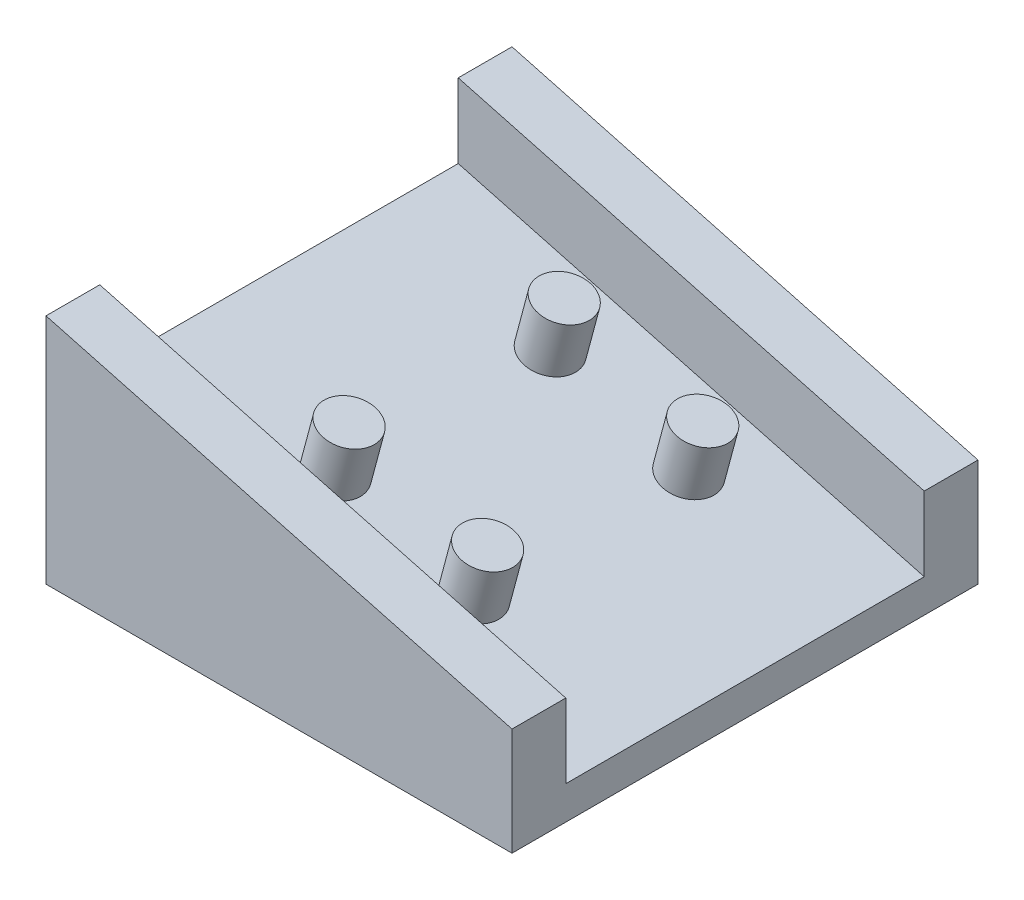
ISO-10303-21;
HEADER;
FILE_DESCRIPTION(('STEP AP214'),'2;1');
FILE_NAME('part.step','',(''),(''),'','','');
FILE_SCHEMA(('AUTOMOTIVE_DESIGN { 1 0 10303 214 1 1 1 1 }'));
ENDSEC;
DATA;
#1=APPLICATION_CONTEXT('core data for automotive mechanical design processes');
#2=APPLICATION_PROTOCOL_DEFINITION('international standard','automotive_design',2000,#1);
#3=PRODUCT_CONTEXT('',#1,'mechanical');
#4=PRODUCT('Part','Part','',(#3));
#5=PRODUCT_RELATED_PRODUCT_CATEGORY('part','',(#4));
#6=PRODUCT_DEFINITION_FORMATION('','',#4);
#7=PRODUCT_DEFINITION_CONTEXT('part definition',#1,'design');
#8=PRODUCT_DEFINITION('design','',#6,#7);
#9=PRODUCT_DEFINITION_SHAPE('','',#8);
#10=(LENGTH_UNIT() NAMED_UNIT(*) SI_UNIT(.MILLI.,.METRE.));
#11=(NAMED_UNIT(*) PLANE_ANGLE_UNIT() SI_UNIT($,.RADIAN.));
#12=(NAMED_UNIT(*) SI_UNIT($,.STERADIAN.) SOLID_ANGLE_UNIT());
#13=UNCERTAINTY_MEASURE_WITH_UNIT(LENGTH_MEASURE(1.E-05),#10,'distance_accuracy_value','');
#14=(GEOMETRIC_REPRESENTATION_CONTEXT(3) GLOBAL_UNCERTAINTY_ASSIGNED_CONTEXT((#13)) GLOBAL_UNIT_ASSIGNED_CONTEXT((#10,
#11,#12)) REPRESENTATION_CONTEXT('',''));
#15=CARTESIAN_POINT('',(0.,0.,0.));
#16=DIRECTION('',(0.,0.,1.));
#17=DIRECTION('',(1.,0.,0.));
#18=AXIS2_PLACEMENT_3D('',#15,#16,#17);
#19=CARTESIAN_POINT('',(0.,12.9666790032092,-26.));
#20=DIRECTION('',(-0.258819045102521,-0.965925826289068,0.));
#21=DIRECTION('',(0.965925826289068,-0.258819045102521,0.));
#22=AXIS2_PLACEMENT_3D('',#19,#20,#21);
#23=PLANE('',#22);
#24=DIRECTION('',(0.,0.,1.));
#25=VECTOR('',#24,1.);
#26=CARTESIAN_POINT('',(0.,12.9666790032092,0.));
#27=LINE('',#26,#25);
#28=CARTESIAN_POINT('',(0.,12.9666790032092,-26.));
#29=VERTEX_POINT('',#28);
#30=CARTESIAN_POINT('',(0.,12.9666790032092,-23.));
#31=VERTEX_POINT('',#30);
#32=EDGE_CURVE('E102',#29,#31,#27,.T.);
#33=ORIENTED_EDGE('',*,*,#32,.T.);
#34=DIRECTION('',(0.965925826289068,-0.258819045102521,0.));
#35=VECTOR('',#34,1.);
#36=CARTESIAN_POINT('',(0.,12.9666790032092,-23.));
#37=LINE('',#36,#35);
#38=CARTESIAN_POINT('',(26.,5.99999999999998,-23.));
#39=VERTEX_POINT('',#38);
#40=EDGE_CURVE('E111',#31,#39,#37,.T.);
#41=ORIENTED_EDGE('',*,*,#40,.T.);
#42=DIRECTION('',(0.,0.,1.));
#43=VECTOR('',#42,1.);
#44=CARTESIAN_POINT('',(26.,6.,-26.));
#45=LINE('',#44,#43);
#46=CARTESIAN_POINT('',(26.,6.,-26.));
#47=VERTEX_POINT('',#46);
#48=EDGE_CURVE('E162',#47,#39,#45,.T.);
#49=ORIENTED_EDGE('',*,*,#48,.F.);
#50=DIRECTION('',(0.965925826289068,-0.258819045102521,0.));
#51=VECTOR('',#50,1.);
#52=CARTESIAN_POINT('',(0.,12.9666790032092,-26.));
#53=LINE('',#52,#51);
#54=EDGE_CURVE('E57',#29,#47,#53,.T.);
#55=ORIENTED_EDGE('',*,*,#54,.F.);
#56=EDGE_LOOP('',(#33,#41,#49,#55));
#57=FACE_BOUND('',#56,.T.);
#58=ADVANCED_FACE('F33',(#57),#23,.F.);
#59=CARTESIAN_POINT('',(0.,12.9666790032092,0.));
#60=DIRECTION('',(1.,0.,0.));
#61=DIRECTION('',(0.,0.,-1.));
#62=AXIS2_PLACEMENT_3D('',#59,#60,#61);
#63=PLANE('',#62);
#64=DIRECTION('',(0.,0.,-1.));
#65=VECTOR('',#64,1.);
#66=CARTESIAN_POINT('',(0.,8.82557428156887,0.));
#67=LINE('',#66,#65);
#68=CARTESIAN_POINT('',(0.,8.82557428156887,-3.));
#69=VERTEX_POINT('',#68);
#70=CARTESIAN_POINT('',(0.,8.82557428156887,-23.));
#71=VERTEX_POINT('',#70);
#72=EDGE_CURVE('E148',#69,#71,#67,.T.);
#73=ORIENTED_EDGE('',*,*,#72,.T.);
#74=DIRECTION('',(0.,1.,0.));
#75=VECTOR('',#74,1.);
#76=CARTESIAN_POINT('',(0.,12.9666790032092,-23.));
#77=LINE('',#76,#75);
#78=EDGE_CURVE('E167',#71,#31,#77,.T.);
#79=ORIENTED_EDGE('',*,*,#78,.T.);
#80=ORIENTED_EDGE('',*,*,#32,.F.);
#81=DIRECTION('',(0.,-1.,0.));
#82=VECTOR('',#81,1.);
#83=CARTESIAN_POINT('',(0.,12.9666790032092,-26.));
#84=LINE('',#83,#82);
#85=CARTESIAN_POINT('',(0.,0.,-26.));
#86=VERTEX_POINT('',#85);
#87=EDGE_CURVE('E84',#29,#86,#84,.T.);
#88=ORIENTED_EDGE('',*,*,#87,.T.);
#89=DIRECTION('',(0.,0.,1.));
#90=VECTOR('',#89,1.);
#91=CARTESIAN_POINT('',(0.,0.,0.));
#92=LINE('',#91,#90);
#93=CARTESIAN_POINT('',(0.,0.,0.));
#94=VERTEX_POINT('',#93);
#95=EDGE_CURVE('E98',#86,#94,#92,.T.);
#96=ORIENTED_EDGE('',*,*,#95,.T.);
#97=DIRECTION('',(0.,-1.,0.));
#98=VECTOR('',#97,1.);
#99=CARTESIAN_POINT('',(0.,12.9666790032092,0.));
#100=LINE('',#99,#98);
#101=CARTESIAN_POINT('',(0.,12.9666790032092,0.));
#102=VERTEX_POINT('',#101);
#103=EDGE_CURVE('E108',#102,#94,#100,.T.);
#104=ORIENTED_EDGE('',*,*,#103,.F.);
#105=CARTESIAN_POINT('',(0.,12.9666790032092,-3.));
#106=VERTEX_POINT('',#105);
#107=EDGE_CURVE('E99',#106,#102,#27,.T.);
#108=ORIENTED_EDGE('',*,*,#107,.F.);
#109=DIRECTION('',(0.,-1.,0.));
#110=VECTOR('',#109,1.);
#111=CARTESIAN_POINT('',(0.,12.9666790032092,-3.));
#112=LINE('',#111,#110);
#113=EDGE_CURVE('E48',#106,#69,#112,.T.);
#114=ORIENTED_EDGE('',*,*,#113,.T.);
#115=EDGE_LOOP('',(#73,#79,#80,#88,#96,#104,#108,#114));
#116=FACE_BOUND('',#115,.T.);
#117=ADVANCED_FACE('F35',(#116),#63,.F.);
#118=CARTESIAN_POINT('',(0.,12.9666790032092,0.));
#119=DIRECTION('',(0.,0.,-1.));
#120=DIRECTION('',(-1.,0.,0.));
#121=AXIS2_PLACEMENT_3D('',#118,#119,#120);
#122=PLANE('',#121);
#123=DIRECTION('',(0.,-1.,0.));
#124=VECTOR('',#123,1.);
#125=CARTESIAN_POINT('',(26.,12.9666790032092,0.));
#126=LINE('',#125,#124);
#127=CARTESIAN_POINT('',(26.,6.,0.));
#128=VERTEX_POINT('',#127);
#129=CARTESIAN_POINT('',(26.,0.,0.));
#130=VERTEX_POINT('',#129);
#131=EDGE_CURVE('E83',#128,#130,#126,.T.);
#132=ORIENTED_EDGE('',*,*,#131,.F.);
#133=DIRECTION('',(0.965925826289068,-0.258819045102521,0.));
#134=VECTOR('',#133,1.);
#135=CARTESIAN_POINT('',(0.,12.9666790032092,0.));
#136=LINE('',#135,#134);
#137=EDGE_CURVE('E175',#102,#128,#136,.T.);
#138=ORIENTED_EDGE('',*,*,#137,.F.);
#139=ORIENTED_EDGE('',*,*,#103,.T.);
#140=DIRECTION('',(1.,0.,0.));
#141=VECTOR('',#140,1.);
#142=CARTESIAN_POINT('',(0.,0.,0.));
#143=LINE('',#142,#141);
#144=EDGE_CURVE('E93',#94,#130,#143,.T.);
#145=ORIENTED_EDGE('',*,*,#144,.T.);
#146=EDGE_LOOP('',(#132,#138,#139,#145));
#147=FACE_BOUND('',#146,.T.);
#148=ADVANCED_FACE('F182',(#147),#122,.F.);
#149=CARTESIAN_POINT('',(26.,12.9666790032092,0.));
#150=DIRECTION('',(-1.,0.,0.));
#151=DIRECTION('',(0.,0.,1.));
#152=AXIS2_PLACEMENT_3D('',#149,#150,#151);
#153=PLANE('',#152);
#154=ORIENTED_EDGE('',*,*,#48,.T.);
#155=DIRECTION('',(0.,-1.,0.));
#156=VECTOR('',#155,1.);
#157=CARTESIAN_POINT('',(26.,12.9666790032092,-23.));
#158=LINE('',#157,#156);
#159=CARTESIAN_POINT('',(26.,1.85889527835965,-23.));
#160=VERTEX_POINT('',#159);
#161=EDGE_CURVE('E161',#39,#160,#158,.T.);
#162=ORIENTED_EDGE('',*,*,#161,.T.);
#163=DIRECTION('',(0.,0.,1.));
#164=VECTOR('',#163,1.);
#165=CARTESIAN_POINT('',(26.,1.85889527835965,0.));
#166=LINE('',#165,#164);
#167=CARTESIAN_POINT('',(26.,1.85889527835965,-3.00000000000001));
#168=VERTEX_POINT('',#167);
#169=EDGE_CURVE('E114',#160,#168,#166,.T.);
#170=ORIENTED_EDGE('',*,*,#169,.T.);
#171=DIRECTION('',(0.,1.,0.));
#172=VECTOR('',#171,1.);
#173=CARTESIAN_POINT('',(26.,12.9666790032092,-3.00000000000001));
#174=LINE('',#173,#172);
#175=CARTESIAN_POINT('',(26.,5.99999999999998,-3.00000000000001));
#176=VERTEX_POINT('',#175);
#177=EDGE_CURVE('E158',#168,#176,#174,.T.);
#178=ORIENTED_EDGE('',*,*,#177,.T.);
#179=EDGE_CURVE('E177',#176,#128,#45,.T.);
#180=ORIENTED_EDGE('',*,*,#179,.T.);
#181=ORIENTED_EDGE('',*,*,#131,.T.);
#182=DIRECTION('',(0.,0.,-1.));
#183=VECTOR('',#182,1.);
#184=CARTESIAN_POINT('',(26.,0.,0.));
#185=LINE('',#184,#183);
#186=CARTESIAN_POINT('',(26.,0.,-26.));
#187=VERTEX_POINT('',#186);
#188=EDGE_CURVE('E87',#130,#187,#185,.T.);
#189=ORIENTED_EDGE('',*,*,#188,.T.);
#190=DIRECTION('',(0.,-1.,0.));
#191=VECTOR('',#190,1.);
#192=CARTESIAN_POINT('',(26.,12.9666790032092,-26.));
#193=LINE('',#192,#191);
#194=EDGE_CURVE('E75',#47,#187,#193,.T.);
#195=ORIENTED_EDGE('',*,*,#194,.F.);
#196=EDGE_LOOP('',(#154,#162,#170,#178,#180,#181,#189,#195));
#197=FACE_BOUND('',#196,.T.);
#198=ADVANCED_FACE('F88',(#197),#153,.F.);
#199=CARTESIAN_POINT('',(0.,12.9666790032092,-26.));
#200=DIRECTION('',(0.,0.,1.));
#201=DIRECTION('',(1.,0.,0.));
#202=AXIS2_PLACEMENT_3D('',#199,#200,#201);
#203=PLANE('',#202);
#204=ORIENTED_EDGE('',*,*,#87,.F.);
#205=ORIENTED_EDGE('',*,*,#54,.T.);
#206=ORIENTED_EDGE('',*,*,#194,.T.);
#207=DIRECTION('',(-1.,0.,0.));
#208=VECTOR('',#207,1.);
#209=CARTESIAN_POINT('',(0.,0.,-26.));
#210=LINE('',#209,#208);
#211=EDGE_CURVE('E79',#187,#86,#210,.T.);
#212=ORIENTED_EDGE('',*,*,#211,.T.);
#213=EDGE_LOOP('',(#204,#205,#206,#212));
#214=FACE_BOUND('',#213,.T.);
#215=ADVANCED_FACE('F77',(#214),#203,.F.);
#216=CARTESIAN_POINT('',(0.,0.,0.));
#217=DIRECTION('',(0.,-1.,0.));
#218=DIRECTION('',(0.,0.,-1.));
#219=AXIS2_PLACEMENT_3D('',#216,#217,#218);
#220=PLANE('',#219);
#221=ORIENTED_EDGE('',*,*,#95,.F.);
#222=ORIENTED_EDGE('',*,*,#211,.F.);
#223=ORIENTED_EDGE('',*,*,#188,.F.);
#224=ORIENTED_EDGE('',*,*,#144,.F.);
#225=EDGE_LOOP('',(#221,#222,#223,#224));
#226=FACE_BOUND('',#225,.T.);
#227=ADVANCED_FACE('F96',(#226),#220,.T.);
#228=ORIENTED_EDGE('',*,*,#179,.F.);
#229=DIRECTION('',(0.965925826289068,-0.258819045102522,0.));
#230=VECTOR('',#229,1.);
#231=CARTESIAN_POINT('',(0.,12.9666790032092,-3.));
#232=LINE('',#231,#230);
#233=EDGE_CURVE('E153',#106,#176,#232,.T.);
#234=ORIENTED_EDGE('',*,*,#233,.F.);
#235=ORIENTED_EDGE('',*,*,#107,.T.);
#236=ORIENTED_EDGE('',*,*,#137,.T.);
#237=EDGE_LOOP('',(#228,#234,#235,#236));
#238=FACE_BOUND('',#237,.T.);
#239=ADVANCED_FACE('F131',(#238),#23,.F.);
#240=CARTESIAN_POINT('',(2.20639357039223,8.23437290619705,0.));
#241=DIRECTION('',(-0.258819045102522,-0.965925826289068,0.));
#242=DIRECTION('',(0.965925826289068,-0.258819045102522,0.));
#243=AXIS2_PLACEMENT_3D('',#240,#241,#242);
#244=PLANE('',#243);
#245=CARTESIAN_POINT('',(16.8637033051563,4.30695859955418,-7.));
#246=DIRECTION('',(-0.258819045102522,-0.965925826289068,0.));
#247=DIRECTION('',(0.965925826289068,-0.258819045102522,0.));
#248=AXIS2_PLACEMENT_3D('',#245,#246,#247);
#249=CIRCLE('',#248,1.45);
#250=CARTESIAN_POINT('',(18.2642957532754,3.93167098415552,-7.));
#251=VERTEX_POINT('',#250);
#252=EDGE_CURVE('E11',#251,#251,#249,.F.);
#253=ORIENTED_EDGE('',*,*,#252,.F.);
#254=EDGE_LOOP('',(#253));
#255=FACE_BOUND('',#254,.T.);
#256=CARTESIAN_POINT('',(16.8637033051563,4.30695859955418,-19.));
#257=DIRECTION('',(-0.258819045102522,-0.965925826289068,0.));
#258=DIRECTION('',(0.965925826289068,-0.258819045102522,0.));
#259=AXIS2_PLACEMENT_3D('',#256,#257,#258);
#260=CIRCLE('',#259,1.45);
#261=CARTESIAN_POINT('',(18.2642957532754,3.93167098415552,-19.));
#262=VERTEX_POINT('',#261);
#263=EDGE_CURVE('E41',#262,#262,#260,.F.);
#264=ORIENTED_EDGE('',*,*,#263,.F.);
#265=EDGE_LOOP('',(#264));
#266=FACE_BOUND('',#265,.T.);
#267=CARTESIAN_POINT('',(9.13629669484373,6.37751096037435,-7.));
#268=DIRECTION('',(-0.258819045102522,-0.965925826289068,0.));
#269=DIRECTION('',(0.965925826289068,-0.258819045102522,0.));
#270=AXIS2_PLACEMENT_3D('',#267,#268,#269);
#271=CIRCLE('',#270,1.45);
#272=CARTESIAN_POINT('',(10.5368891429629,6.00222334497569,-7.));
#273=VERTEX_POINT('',#272);
#274=EDGE_CURVE('E120',#273,#273,#271,.F.);
#275=ORIENTED_EDGE('',*,*,#274,.F.);
#276=EDGE_LOOP('',(#275));
#277=FACE_BOUND('',#276,.T.);
#278=CARTESIAN_POINT('',(9.13629669484373,6.37751096037435,-19.));
#279=DIRECTION('',(-0.258819045102522,-0.965925826289068,0.));
#280=DIRECTION('',(0.965925826289068,-0.258819045102522,0.));
#281=AXIS2_PLACEMENT_3D('',#278,#279,#280);
#282=CIRCLE('',#281,1.45);
#283=CARTESIAN_POINT('',(10.5368891429629,6.00222334497569,-19.));
#284=VERTEX_POINT('',#283);
#285=EDGE_CURVE('E117',#284,#284,#282,.F.);
#286=ORIENTED_EDGE('',*,*,#285,.F.);
#287=EDGE_LOOP('',(#286));
#288=FACE_BOUND('',#287,.T.);
#289=DIRECTION('',(0.965925826289068,-0.258819045102522,0.));
#290=VECTOR('',#289,1.);
#291=CARTESIAN_POINT('',(-1.03527618041008,9.10297569805293,-3.));
#292=LINE('',#291,#290);
#293=EDGE_CURVE('E142',#69,#168,#292,.T.);
#294=ORIENTED_EDGE('',*,*,#293,.T.);
#295=ORIENTED_EDGE('',*,*,#169,.F.);
#296=DIRECTION('',(-0.965925826289068,0.258819045102522,0.));
#297=VECTOR('',#296,1.);
#298=CARTESIAN_POINT('',(-1.03527618041009,9.10297569805293,-23.));
#299=LINE('',#298,#297);
#300=EDGE_CURVE('E152',#160,#71,#299,.T.);
#301=ORIENTED_EDGE('',*,*,#300,.T.);
#302=ORIENTED_EDGE('',*,*,#72,.F.);
#303=EDGE_LOOP('',(#294,#295,#301,#302));
#304=FACE_BOUND('',#303,.T.);
#305=ADVANCED_FACE('F127',(#255,#266,#277,#288,#304),#244,.F.);
#306=CARTESIAN_POINT('',(-1.03527618041009,9.10297569805293,-23.));
#307=DIRECTION('',(0.,0.,-1.));
#308=DIRECTION('',(-1.,0.,0.));
#309=AXIS2_PLACEMENT_3D('',#306,#307,#308);
#310=PLANE('',#309);
#311=ORIENTED_EDGE('',*,*,#300,.F.);
#312=ORIENTED_EDGE('',*,*,#161,.F.);
#313=ORIENTED_EDGE('',*,*,#40,.F.);
#314=ORIENTED_EDGE('',*,*,#78,.F.);
#315=EDGE_LOOP('',(#311,#312,#313,#314));
#316=FACE_BOUND('',#315,.T.);
#317=ADVANCED_FACE('F130',(#316),#310,.F.);
#318=CARTESIAN_POINT('',(-1.03527618041008,9.10297569805293,-3.));
#319=DIRECTION('',(0.,0.,1.));
#320=DIRECTION('',(1.,0.,0.));
#321=AXIS2_PLACEMENT_3D('',#318,#319,#320);
#322=PLANE('',#321);
#323=ORIENTED_EDGE('',*,*,#233,.T.);
#324=ORIENTED_EDGE('',*,*,#177,.F.);
#325=ORIENTED_EDGE('',*,*,#293,.F.);
#326=ORIENTED_EDGE('',*,*,#113,.F.);
#327=EDGE_LOOP('',(#323,#324,#325,#326));
#328=FACE_BOUND('',#327,.T.);
#329=ADVANCED_FACE('F254',(#328),#322,.F.);
#330=CARTESIAN_POINT('',(9.9127538301513,9.27528843924156,-19.));
#331=DIRECTION('',(-0.258819045102522,-0.965925826289068,0.));
#332=DIRECTION('',(0.965925826289068,-0.258819045102522,0.));
#333=AXIS2_PLACEMENT_3D('',#330,#331,#332);
#334=CYLINDRICAL_SURFACE('',#333,1.45);
#335=CARTESIAN_POINT('',(9.9127538301513,9.27528843924156,-19.));
#336=DIRECTION('',(0.258819045102522,0.965925826289068,0.));
#337=DIRECTION('',(-0.965925826289068,0.258819045102522,0.));
#338=AXIS2_PLACEMENT_3D('',#335,#336,#337);
#339=CIRCLE('',#338,1.45);
#340=CARTESIAN_POINT('',(8.51216138203215,9.65057605464021,-19.));
#341=VERTEX_POINT('',#340);
#342=EDGE_CURVE('E361',#341,#341,#339,.T.);
#343=ORIENTED_EDGE('',*,*,#342,.F.);
#344=EDGE_LOOP('',(#343));
#345=FACE_BOUND('',#344,.T.);
#346=ORIENTED_EDGE('',*,*,#285,.T.);
#347=EDGE_LOOP('',(#346));
#348=FACE_BOUND('',#347,.T.);
#349=ADVANCED_FACE('F264',(#345,#348),#334,.T.);
#350=CARTESIAN_POINT('',(9.9127538301513,9.27528843924156,-19.));
#351=DIRECTION('',(0.258819045102522,0.965925826289068,0.));
#352=DIRECTION('',(-0.965925826289068,0.258819045102522,0.));
#353=AXIS2_PLACEMENT_3D('',#350,#351,#352);
#354=PLANE('',#353);
#355=ORIENTED_EDGE('',*,*,#342,.T.);
#356=EDGE_LOOP('',(#355));
#357=FACE_BOUND('',#356,.T.);
#358=ADVANCED_FACE('F277',(#357),#354,.T.);
#359=CARTESIAN_POINT('',(9.9127538301513,9.27528843924156,-7.));
#360=DIRECTION('',(-0.258819045102522,-0.965925826289068,0.));
#361=DIRECTION('',(0.965925826289068,-0.258819045102522,0.));
#362=AXIS2_PLACEMENT_3D('',#359,#360,#361);
#363=CYLINDRICAL_SURFACE('',#362,1.45);
#364=CARTESIAN_POINT('',(9.9127538301513,9.27528843924156,-7.));
#365=DIRECTION('',(0.258819045102522,0.965925826289068,0.));
#366=DIRECTION('',(0.965925826289068,-0.258819045102522,0.));
#367=AXIS2_PLACEMENT_3D('',#364,#365,#366);
#368=CIRCLE('',#367,1.45);
#369=CARTESIAN_POINT('',(11.3133462782704,8.9000008238429,-7.));
#370=VERTEX_POINT('',#369);
#371=EDGE_CURVE('E356',#370,#370,#368,.T.);
#372=ORIENTED_EDGE('',*,*,#371,.F.);
#373=EDGE_LOOP('',(#372));
#374=FACE_BOUND('',#373,.T.);
#375=ORIENTED_EDGE('',*,*,#274,.T.);
#376=EDGE_LOOP('',(#375));
#377=FACE_BOUND('',#376,.T.);
#378=ADVANCED_FACE('F287',(#374,#377),#363,.T.);
#379=CARTESIAN_POINT('',(9.9127538301513,9.27528843924156,-7.));
#380=DIRECTION('',(-0.258819045102522,-0.965925826289068,0.));
#381=DIRECTION('',(0.965925826289068,-0.258819045102522,0.));
#382=AXIS2_PLACEMENT_3D('',#379,#380,#381);
#383=PLANE('',#382);
#384=ORIENTED_EDGE('',*,*,#371,.T.);
#385=EDGE_LOOP('',(#384));
#386=FACE_BOUND('',#385,.T.);
#387=ADVANCED_FACE('F297',(#386),#383,.F.);
#388=CARTESIAN_POINT('',(17.6401604404638,7.20473607842138,-19.));
#389=DIRECTION('',(-0.258819045102522,-0.965925826289068,0.));
#390=DIRECTION('',(0.965925826289068,-0.258819045102522,0.));
#391=AXIS2_PLACEMENT_3D('',#388,#389,#390);
#392=CYLINDRICAL_SURFACE('',#391,1.45);
#393=CARTESIAN_POINT('',(17.6401604404638,7.20473607842138,-19.));
#394=DIRECTION('',(0.258819045102522,0.965925826289068,0.));
#395=DIRECTION('',(0.965925826289068,-0.258819045102522,0.));
#396=AXIS2_PLACEMENT_3D('',#393,#394,#395);
#397=CIRCLE('',#396,1.45);
#398=CARTESIAN_POINT('',(19.040752888583,6.82944846302273,-19.));
#399=VERTEX_POINT('',#398);
#400=EDGE_CURVE('E353',#399,#399,#397,.T.);
#401=ORIENTED_EDGE('',*,*,#400,.F.);
#402=EDGE_LOOP('',(#401));
#403=FACE_BOUND('',#402,.T.);
#404=ORIENTED_EDGE('',*,*,#263,.T.);
#405=EDGE_LOOP('',(#404));
#406=FACE_BOUND('',#405,.T.);
#407=ADVANCED_FACE('F125',(#403,#406),#392,.T.);
#408=CARTESIAN_POINT('',(17.6401604404638,7.20473607842138,-19.));
#409=DIRECTION('',(-0.258819045102522,-0.965925826289068,0.));
#410=DIRECTION('',(0.965925826289068,-0.258819045102522,0.));
#411=AXIS2_PLACEMENT_3D('',#408,#409,#410);
#412=PLANE('',#411);
#413=ORIENTED_EDGE('',*,*,#400,.T.);
#414=EDGE_LOOP('',(#413));
#415=FACE_BOUND('',#414,.T.);
#416=ADVANCED_FACE('F316',(#415),#412,.F.);
#417=CARTESIAN_POINT('',(17.6401604404638,7.20473607842138,-7.));
#418=DIRECTION('',(-0.258819045102522,-0.965925826289068,0.));
#419=DIRECTION('',(0.965925826289068,-0.258819045102522,0.));
#420=AXIS2_PLACEMENT_3D('',#417,#418,#419);
#421=CYLINDRICAL_SURFACE('',#420,1.45);
#422=CARTESIAN_POINT('',(17.6401604404638,7.20473607842138,-7.));
#423=DIRECTION('',(0.258819045102522,0.965925826289068,0.));
#424=DIRECTION('',(-0.965925826289068,0.258819045102522,0.));
#425=AXIS2_PLACEMENT_3D('',#422,#423,#424);
#426=CIRCLE('',#425,1.45);
#427=CARTESIAN_POINT('',(16.2395679923447,7.58002369382004,-7.));
#428=VERTEX_POINT('',#427);
#429=EDGE_CURVE('E352',#428,#428,#426,.T.);
#430=ORIENTED_EDGE('',*,*,#429,.F.);
#431=EDGE_LOOP('',(#430));
#432=FACE_BOUND('',#431,.T.);
#433=ORIENTED_EDGE('',*,*,#252,.T.);
#434=EDGE_LOOP('',(#433));
#435=FACE_BOUND('',#434,.T.);
#436=ADVANCED_FACE('F326',(#432,#435),#421,.T.);
#437=CARTESIAN_POINT('',(17.6401604404638,7.20473607842138,-7.));
#438=DIRECTION('',(0.258819045102522,0.965925826289068,0.));
#439=DIRECTION('',(-0.965925826289068,0.258819045102522,0.));
#440=AXIS2_PLACEMENT_3D('',#437,#438,#439);
#441=PLANE('',#440);
#442=ORIENTED_EDGE('',*,*,#429,.T.);
#443=EDGE_LOOP('',(#442));
#444=FACE_BOUND('',#443,.T.);
#445=ADVANCED_FACE('F336',(#444),#441,.T.);
#446=CLOSED_SHELL('',(#58,#117,#148,#198,#215,#227,#239,#305,#317,#329,#349,#358,#378,#387,#407,
#416,#436,#445));
#447=MANIFOLD_SOLID_BREP('B2',#446);
#448=ADVANCED_BREP_SHAPE_REPRESENTATION('',(#18,#447),#14);
#449=SHAPE_DEFINITION_REPRESENTATION(#9,#448);
ENDSEC;
END-ISO-10303-21;
